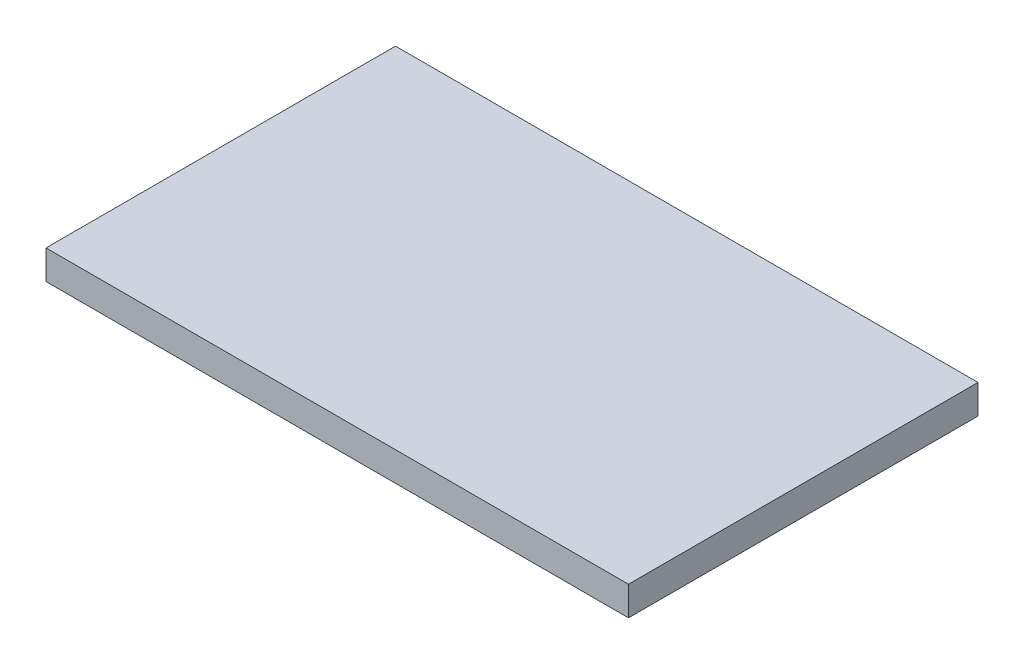
ISO-10303-21;
HEADER;
FILE_DESCRIPTION(('STEP AP214'),'2;1');
FILE_NAME('part.step','',(''),(''),'','','');
FILE_SCHEMA(('AUTOMOTIVE_DESIGN { 1 0 10303 214 1 1 1 1 }'));
ENDSEC;
DATA;
#1=APPLICATION_CONTEXT('core data for automotive mechanical design processes');
#2=APPLICATION_PROTOCOL_DEFINITION('international standard','automotive_design',2000,#1);
#3=PRODUCT_CONTEXT('',#1,'mechanical');
#4=PRODUCT('Part','Part','',(#3));
#5=PRODUCT_RELATED_PRODUCT_CATEGORY('part','',(#4));
#6=PRODUCT_DEFINITION_FORMATION('','',#4);
#7=PRODUCT_DEFINITION_CONTEXT('part definition',#1,'design');
#8=PRODUCT_DEFINITION('design','',#6,#7);
#9=PRODUCT_DEFINITION_SHAPE('','',#8);
#10=(LENGTH_UNIT() NAMED_UNIT(*) SI_UNIT(.MILLI.,.METRE.));
#11=(NAMED_UNIT(*) PLANE_ANGLE_UNIT() SI_UNIT($,.RADIAN.));
#12=(NAMED_UNIT(*) SI_UNIT($,.STERADIAN.) SOLID_ANGLE_UNIT());
#13=UNCERTAINTY_MEASURE_WITH_UNIT(LENGTH_MEASURE(1.E-05),#10,'distance_accuracy_value','');
#14=(GEOMETRIC_REPRESENTATION_CONTEXT(3) GLOBAL_UNCERTAINTY_ASSIGNED_CONTEXT((#13)) GLOBAL_UNIT_ASSIGNED_CONTEXT((#10,
#11,#12)) REPRESENTATION_CONTEXT('',''));
#15=CARTESIAN_POINT('',(0.,0.,0.));
#16=DIRECTION('',(0.,0.,1.));
#17=DIRECTION('',(1.,0.,0.));
#18=AXIS2_PLACEMENT_3D('',#15,#16,#17);
#19=CARTESIAN_POINT('',(31.75,3.175,19.05));
#20=DIRECTION('',(-1.,0.,0.));
#21=DIRECTION('',(0.,0.,1.));
#22=AXIS2_PLACEMENT_3D('',#19,#20,#21);
#23=PLANE('',#22);
#24=DIRECTION('',(0.,0.,-1.));
#25=VECTOR('',#24,1.);
#26=CARTESIAN_POINT('',(31.75,0.,19.05));
#27=LINE('',#26,#25);
#28=CARTESIAN_POINT('',(31.75,0.,19.05));
#29=VERTEX_POINT('',#28);
#30=CARTESIAN_POINT('',(31.75,0.,-19.05));
#31=VERTEX_POINT('',#30);
#32=EDGE_CURVE('E96',#29,#31,#27,.T.);
#33=ORIENTED_EDGE('',*,*,#32,.T.);
#34=DIRECTION('',(0.,-1.,0.));
#35=VECTOR('',#34,1.);
#36=CARTESIAN_POINT('',(31.75,3.175,-19.05));
#37=LINE('',#36,#35);
#38=CARTESIAN_POINT('',(31.75,3.175,-19.05));
#39=VERTEX_POINT('',#38);
#40=EDGE_CURVE('E11',#39,#31,#37,.T.);
#41=ORIENTED_EDGE('',*,*,#40,.F.);
#42=DIRECTION('',(0.,0.,-1.));
#43=VECTOR('',#42,1.);
#44=CARTESIAN_POINT('',(31.75,3.175,19.05));
#45=LINE('',#44,#43);
#46=CARTESIAN_POINT('',(31.75,3.175,19.05));
#47=VERTEX_POINT('',#46);
#48=EDGE_CURVE('E84',#47,#39,#45,.T.);
#49=ORIENTED_EDGE('',*,*,#48,.F.);
#50=DIRECTION('',(0.,-1.,0.));
#51=VECTOR('',#50,1.);
#52=CARTESIAN_POINT('',(31.75,3.175,19.05));
#53=LINE('',#52,#51);
#54=EDGE_CURVE('E92',#47,#29,#53,.T.);
#55=ORIENTED_EDGE('',*,*,#54,.T.);
#56=EDGE_LOOP('',(#33,#41,#49,#55));
#57=FACE_BOUND('',#56,.T.);
#58=ADVANCED_FACE('F33',(#57),#23,.F.);
#59=CARTESIAN_POINT('',(-31.75,3.175,-19.05));
#60=DIRECTION('',(0.,0.,1.));
#61=DIRECTION('',(1.,0.,0.));
#62=AXIS2_PLACEMENT_3D('',#59,#60,#61);
#63=PLANE('',#62);
#64=DIRECTION('',(-1.,0.,0.));
#65=VECTOR('',#64,1.);
#66=CARTESIAN_POINT('',(-31.75,0.,-19.05));
#67=LINE('',#66,#65);
#68=CARTESIAN_POINT('',(-31.75,0.,-19.05));
#69=VERTEX_POINT('',#68);
#70=EDGE_CURVE('E88',#31,#69,#67,.T.);
#71=ORIENTED_EDGE('',*,*,#70,.T.);
#72=DIRECTION('',(0.,-1.,0.));
#73=VECTOR('',#72,1.);
#74=CARTESIAN_POINT('',(-31.75,3.175,-19.05));
#75=LINE('',#74,#73);
#76=CARTESIAN_POINT('',(-31.75,3.175,-19.05));
#77=VERTEX_POINT('',#76);
#78=EDGE_CURVE('E41',#77,#69,#75,.T.);
#79=ORIENTED_EDGE('',*,*,#78,.F.);
#80=DIRECTION('',(-1.,0.,0.));
#81=VECTOR('',#80,1.);
#82=CARTESIAN_POINT('',(-31.75,3.175,-19.05));
#83=LINE('',#82,#81);
#84=EDGE_CURVE('E79',#39,#77,#83,.T.);
#85=ORIENTED_EDGE('',*,*,#84,.F.);
#86=ORIENTED_EDGE('',*,*,#40,.T.);
#87=EDGE_LOOP('',(#71,#79,#85,#86));
#88=FACE_BOUND('',#87,.T.);
#89=ADVANCED_FACE('F87',(#88),#63,.F.);
#90=CARTESIAN_POINT('',(-31.75,3.175,19.05));
#91=DIRECTION('',(1.,0.,0.));
#92=DIRECTION('',(0.,0.,-1.));
#93=AXIS2_PLACEMENT_3D('',#90,#91,#92);
#94=PLANE('',#93);
#95=DIRECTION('',(0.,0.,1.));
#96=VECTOR('',#95,1.);
#97=CARTESIAN_POINT('',(-31.75,0.,19.05));
#98=LINE('',#97,#96);
#99=CARTESIAN_POINT('',(-31.75,0.,19.05));
#100=VERTEX_POINT('',#99);
#101=EDGE_CURVE('E66',#69,#100,#98,.T.);
#102=ORIENTED_EDGE('',*,*,#101,.T.);
#103=DIRECTION('',(0.,-1.,0.));
#104=VECTOR('',#103,1.);
#105=CARTESIAN_POINT('',(-31.75,3.175,19.05));
#106=LINE('',#105,#104);
#107=CARTESIAN_POINT('',(-31.75,3.175,19.05));
#108=VERTEX_POINT('',#107);
#109=EDGE_CURVE('E89',#108,#100,#106,.T.);
#110=ORIENTED_EDGE('',*,*,#109,.F.);
#111=DIRECTION('',(0.,0.,1.));
#112=VECTOR('',#111,1.);
#113=CARTESIAN_POINT('',(-31.75,3.175,19.05));
#114=LINE('',#113,#112);
#115=EDGE_CURVE('E82',#77,#108,#114,.T.);
#116=ORIENTED_EDGE('',*,*,#115,.F.);
#117=ORIENTED_EDGE('',*,*,#78,.T.);
#118=EDGE_LOOP('',(#102,#110,#116,#117));
#119=FACE_BOUND('',#118,.T.);
#120=ADVANCED_FACE('F90',(#119),#94,.F.);
#121=CARTESIAN_POINT('',(-31.75,3.175,19.05));
#122=DIRECTION('',(0.,0.,-1.));
#123=DIRECTION('',(-1.,0.,0.));
#124=AXIS2_PLACEMENT_3D('',#121,#122,#123);
#125=PLANE('',#124);
#126=DIRECTION('',(1.,0.,0.));
#127=VECTOR('',#126,1.);
#128=CARTESIAN_POINT('',(-31.75,0.,19.05));
#129=LINE('',#128,#127);
#130=EDGE_CURVE('E72',#100,#29,#129,.T.);
#131=ORIENTED_EDGE('',*,*,#130,.T.);
#132=ORIENTED_EDGE('',*,*,#54,.F.);
#133=DIRECTION('',(1.,0.,0.));
#134=VECTOR('',#133,1.);
#135=CARTESIAN_POINT('',(-31.75,3.175,19.05));
#136=LINE('',#135,#134);
#137=EDGE_CURVE('E49',#108,#47,#136,.T.);
#138=ORIENTED_EDGE('',*,*,#137,.F.);
#139=ORIENTED_EDGE('',*,*,#109,.T.);
#140=EDGE_LOOP('',(#131,#132,#138,#139));
#141=FACE_BOUND('',#140,.T.);
#142=ADVANCED_FACE('F103',(#141),#125,.F.);
#143=CARTESIAN_POINT('',(0.,3.175,0.));
#144=DIRECTION('',(0.,-1.,0.));
#145=DIRECTION('',(0.,0.,-1.));
#146=AXIS2_PLACEMENT_3D('',#143,#144,#145);
#147=PLANE('',#146);
#148=ORIENTED_EDGE('',*,*,#48,.T.);
#149=ORIENTED_EDGE('',*,*,#84,.T.);
#150=ORIENTED_EDGE('',*,*,#115,.T.);
#151=ORIENTED_EDGE('',*,*,#137,.T.);
#152=EDGE_LOOP('',(#148,#149,#150,#151));
#153=FACE_BOUND('',#152,.T.);
#154=ADVANCED_FACE('F80',(#153),#147,.F.);
#155=CARTESIAN_POINT('',(0.,0.,0.));
#156=DIRECTION('',(0.,-1.,0.));
#157=DIRECTION('',(0.,0.,-1.));
#158=AXIS2_PLACEMENT_3D('',#155,#156,#157);
#159=PLANE('',#158);
#160=ORIENTED_EDGE('',*,*,#32,.F.);
#161=ORIENTED_EDGE('',*,*,#130,.F.);
#162=ORIENTED_EDGE('',*,*,#101,.F.);
#163=ORIENTED_EDGE('',*,*,#70,.F.);
#164=EDGE_LOOP('',(#160,#161,#162,#163));
#165=FACE_BOUND('',#164,.T.);
#166=ADVANCED_FACE('F106',(#165),#159,.T.);
#167=CLOSED_SHELL('',(#58,#89,#120,#142,#154,#166));
#168=MANIFOLD_SOLID_BREP('B2',#167);
#169=ADVANCED_BREP_SHAPE_REPRESENTATION('',(#18,#168),#14);
#170=SHAPE_DEFINITION_REPRESENTATION(#9,#169);
ENDSEC;
END-ISO-10303-21;
